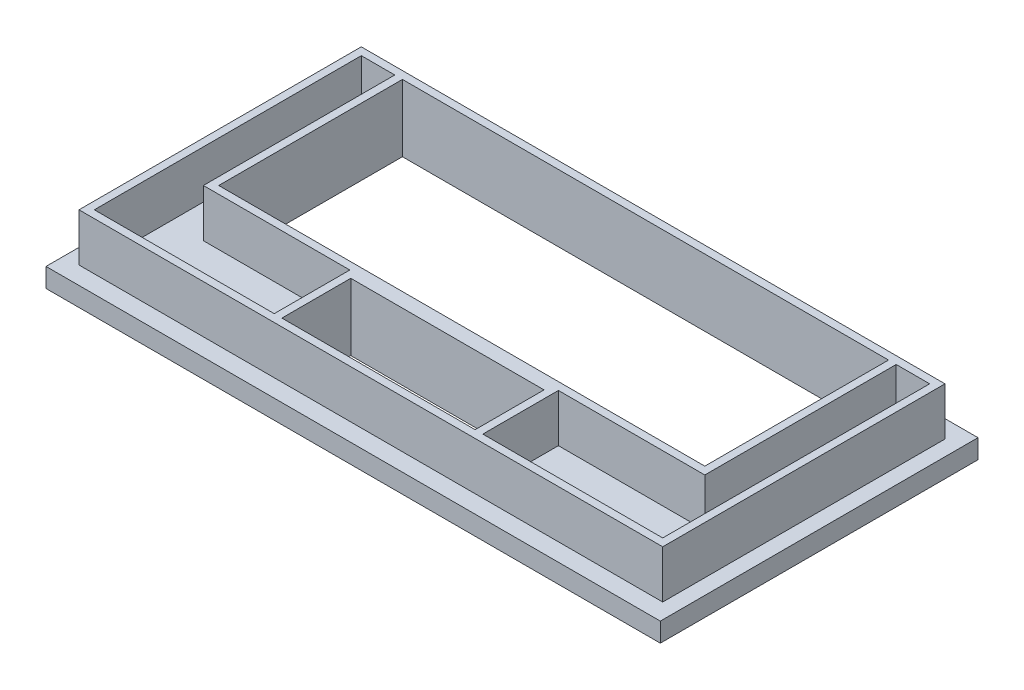
ISO-10303-21;
HEADER;
FILE_DESCRIPTION(('STEP AP214'),'2;1');
FILE_NAME('part.step','',(''),(''),'','','');
FILE_SCHEMA(('AUTOMOTIVE_DESIGN { 1 0 10303 214 1 1 1 1 }'));
ENDSEC;
DATA;
#1=APPLICATION_CONTEXT('core data for automotive mechanical design processes');
#2=APPLICATION_PROTOCOL_DEFINITION('international standard','automotive_design',2000,#1);
#3=PRODUCT_CONTEXT('',#1,'mechanical');
#4=PRODUCT('Part','Part','',(#3));
#5=PRODUCT_RELATED_PRODUCT_CATEGORY('part','',(#4));
#6=PRODUCT_DEFINITION_FORMATION('','',#4);
#7=PRODUCT_DEFINITION_CONTEXT('part definition',#1,'design');
#8=PRODUCT_DEFINITION('design','',#6,#7);
#9=PRODUCT_DEFINITION_SHAPE('','',#8);
#10=(LENGTH_UNIT() NAMED_UNIT(*) SI_UNIT(.MILLI.,.METRE.));
#11=(NAMED_UNIT(*) PLANE_ANGLE_UNIT() SI_UNIT($,.RADIAN.));
#12=(NAMED_UNIT(*) SI_UNIT($,.STERADIAN.) SOLID_ANGLE_UNIT());
#13=UNCERTAINTY_MEASURE_WITH_UNIT(LENGTH_MEASURE(1.E-05),#10,'distance_accuracy_value','');
#14=(GEOMETRIC_REPRESENTATION_CONTEXT(3) GLOBAL_UNCERTAINTY_ASSIGNED_CONTEXT((#13)) GLOBAL_UNIT_ASSIGNED_CONTEXT((#10,
#11,#12)) REPRESENTATION_CONTEXT('',''));
#15=CARTESIAN_POINT('',(0.,0.,0.));
#16=DIRECTION('',(0.,0.,1.));
#17=DIRECTION('',(1.,0.,0.));
#18=AXIS2_PLACEMENT_3D('',#15,#16,#17);
#19=CARTESIAN_POINT('',(0.,2.,0.));
#20=DIRECTION('',(0.,1.,0.));
#21=DIRECTION('',(0.,0.,1.));
#22=AXIS2_PLACEMENT_3D('',#19,#20,#21);
#23=PLANE('',#22);
#24=DIRECTION('',(1.,0.,0.));
#25=VECTOR('',#24,1.);
#26=CARTESIAN_POINT('',(-26.2,2.,6.05));
#27=LINE('',#26,#25);
#28=CARTESIAN_POINT('',(-26.2,2.,6.05));
#29=VERTEX_POINT('',#28);
#30=CARTESIAN_POINT('',(-10.9,2.,6.05));
#31=VERTEX_POINT('',#30);
#32=EDGE_CURVE('E50',#29,#31,#27,.T.);
#33=ORIENTED_EDGE('',*,*,#32,.F.);
#34=DIRECTION('',(0.,0.,1.));
#35=VECTOR('',#34,1.);
#36=CARTESIAN_POINT('',(-26.2,2.,-13.95));
#37=LINE('',#36,#35);
#38=CARTESIAN_POINT('',(-26.2,2.,-13.95));
#39=VERTEX_POINT('',#38);
#40=EDGE_CURVE('E254',#39,#29,#37,.T.);
#41=ORIENTED_EDGE('',*,*,#40,.F.);
#42=DIRECTION('',(-1.,0.,0.));
#43=VECTOR('',#42,1.);
#44=CARTESIAN_POINT('',(-29.7,2.,-13.95));
#45=LINE('',#44,#43);
#46=CARTESIAN_POINT('',(-29.7,2.,-13.95));
#47=VERTEX_POINT('',#46);
#48=EDGE_CURVE('E347',#39,#47,#45,.T.);
#49=ORIENTED_EDGE('',*,*,#48,.T.);
#50=DIRECTION('',(0.,0.,1.));
#51=VECTOR('',#50,1.);
#52=CARTESIAN_POINT('',(-29.7,2.,-13.95));
#53=LINE('',#52,#51);
#54=CARTESIAN_POINT('',(-29.7,2.,13.95));
#55=VERTEX_POINT('',#54);
#56=EDGE_CURVE('E351',#47,#55,#53,.T.);
#57=ORIENTED_EDGE('',*,*,#56,.T.);
#58=DIRECTION('',(1.,0.,0.));
#59=VECTOR('',#58,1.);
#60=CARTESIAN_POINT('',(-29.7,2.,13.95));
#61=LINE('',#60,#59);
#62=CARTESIAN_POINT('',(-10.9,2.,13.95));
#63=VERTEX_POINT('',#62);
#64=EDGE_CURVE('E334',#55,#63,#61,.T.);
#65=ORIENTED_EDGE('',*,*,#64,.T.);
#66=DIRECTION('',(0.,0.,1.));
#67=VECTOR('',#66,1.);
#68=CARTESIAN_POINT('',(-10.9,2.,6.05));
#69=LINE('',#68,#67);
#70=EDGE_CURVE('E55',#31,#63,#69,.T.);
#71=ORIENTED_EDGE('',*,*,#70,.F.);
#72=EDGE_LOOP('',(#33,#41,#49,#57,#65,#71));
#73=FACE_BOUND('',#72,.T.);
#74=ADVANCED_FACE('F35',(#73),#23,.T.);
#75=DIRECTION('',(1.,0.,0.));
#76=VECTOR('',#75,1.);
#77=CARTESIAN_POINT('',(26.2,2.,6.04999999999996));
#78=LINE('',#77,#76);
#79=CARTESIAN_POINT('',(10.9,2.,6.04999999999999));
#80=VERTEX_POINT('',#79);
#81=CARTESIAN_POINT('',(26.2,2.,6.04999999999996));
#82=VERTEX_POINT('',#81);
#83=EDGE_CURVE('E298',#80,#82,#78,.T.);
#84=ORIENTED_EDGE('',*,*,#83,.F.);
#85=DIRECTION('',(0.,0.,-1.));
#86=VECTOR('',#85,1.);
#87=CARTESIAN_POINT('',(10.9,2.,6.04999999999999));
#88=LINE('',#87,#86);
#89=CARTESIAN_POINT('',(10.9,2.,13.95));
#90=VERTEX_POINT('',#89);
#91=EDGE_CURVE('E294',#90,#80,#88,.T.);
#92=ORIENTED_EDGE('',*,*,#91,.F.);
#93=CARTESIAN_POINT('',(29.7,2.,13.95));
#94=VERTEX_POINT('',#93);
#95=EDGE_CURVE('E353',#90,#94,#61,.T.);
#96=ORIENTED_EDGE('',*,*,#95,.T.);
#97=DIRECTION('',(0.,0.,-1.));
#98=VECTOR('',#97,1.);
#99=CARTESIAN_POINT('',(29.7,2.,-13.95));
#100=LINE('',#99,#98);
#101=CARTESIAN_POINT('',(29.7,2.,-13.95));
#102=VERTEX_POINT('',#101);
#103=EDGE_CURVE('E330',#94,#102,#100,.T.);
#104=ORIENTED_EDGE('',*,*,#103,.T.);
#105=CARTESIAN_POINT('',(26.2,2.,-13.95));
#106=VERTEX_POINT('',#105);
#107=EDGE_CURVE('E348',#102,#106,#45,.T.);
#108=ORIENTED_EDGE('',*,*,#107,.T.);
#109=DIRECTION('',(0.,0.,-1.));
#110=VECTOR('',#109,1.);
#111=CARTESIAN_POINT('',(26.2,2.,-13.95));
#112=LINE('',#111,#110);
#113=EDGE_CURVE('E302',#82,#106,#112,.T.);
#114=ORIENTED_EDGE('',*,*,#113,.F.);
#115=EDGE_LOOP('',(#84,#92,#96,#104,#108,#114));
#116=FACE_BOUND('',#115,.T.);
#117=ADVANCED_FACE('F449',(#116),#23,.T.);
#118=CARTESIAN_POINT('',(-29.7,7.,-13.95));
#119=DIRECTION('',(0.,0.,1.));
#120=DIRECTION('',(1.,0.,0.));
#121=AXIS2_PLACEMENT_3D('',#118,#119,#120);
#122=PLANE('',#121);
#123=ORIENTED_EDGE('',*,*,#48,.F.);
#124=DIRECTION('',(0.,-1.,0.));
#125=VECTOR('',#124,1.);
#126=CARTESIAN_POINT('',(-26.2,66.3647201627364,-13.95));
#127=LINE('',#126,#125);
#128=CARTESIAN_POINT('',(-26.2,7.,-13.95));
#129=VERTEX_POINT('',#128);
#130=EDGE_CURVE('E282',#129,#39,#127,.T.);
#131=ORIENTED_EDGE('',*,*,#130,.F.);
#132=DIRECTION('',(-1.,0.,0.));
#133=VECTOR('',#132,1.);
#134=CARTESIAN_POINT('',(-29.7,7.,-13.95));
#135=LINE('',#134,#133);
#136=CARTESIAN_POINT('',(-29.7,7.,-13.95));
#137=VERTEX_POINT('',#136);
#138=EDGE_CURVE('E333',#129,#137,#135,.T.);
#139=ORIENTED_EDGE('',*,*,#138,.T.);
#140=DIRECTION('',(0.,-1.,0.));
#141=VECTOR('',#140,1.);
#142=CARTESIAN_POINT('',(-29.7,7.,-13.95));
#143=LINE('',#142,#141);
#144=EDGE_CURVE('E360',#137,#47,#143,.T.);
#145=ORIENTED_EDGE('',*,*,#144,.T.);
#146=EDGE_LOOP('',(#123,#131,#139,#145));
#147=FACE_BOUND('',#146,.T.);
#148=ADVANCED_FACE('F454',(#147),#122,.T.);
#149=CARTESIAN_POINT('',(29.7,7.,-13.95));
#150=VERTEX_POINT('',#149);
#151=CARTESIAN_POINT('',(26.2,7.,-13.95));
#152=VERTEX_POINT('',#151);
#153=EDGE_CURVE('E335',#150,#152,#135,.T.);
#154=ORIENTED_EDGE('',*,*,#153,.T.);
#155=DIRECTION('',(0.,-1.,0.));
#156=VECTOR('',#155,1.);
#157=CARTESIAN_POINT('',(26.2,66.3647201627364,-13.95));
#158=LINE('',#157,#156);
#159=EDGE_CURVE('E242',#152,#106,#158,.T.);
#160=ORIENTED_EDGE('',*,*,#159,.T.);
#161=ORIENTED_EDGE('',*,*,#107,.F.);
#162=DIRECTION('',(0.,-1.,0.));
#163=VECTOR('',#162,1.);
#164=CARTESIAN_POINT('',(29.7,7.,-13.95));
#165=LINE('',#164,#163);
#166=EDGE_CURVE('E363',#150,#102,#165,.T.);
#167=ORIENTED_EDGE('',*,*,#166,.F.);
#168=EDGE_LOOP('',(#154,#160,#161,#167));
#169=FACE_BOUND('',#168,.T.);
#170=ADVANCED_FACE('F519',(#169),#122,.T.);
#171=DIRECTION('',(0.,1.,0.));
#172=VECTOR('',#171,1.);
#173=CARTESIAN_POINT('',(25.4,0.,-13.95));
#174=LINE('',#173,#172);
#175=CARTESIAN_POINT('',(25.4,0.,-13.95));
#176=VERTEX_POINT('',#175);
#177=CARTESIAN_POINT('',(25.4,7.,-13.95));
#178=VERTEX_POINT('',#177);
#179=EDGE_CURVE('E309',#176,#178,#174,.T.);
#180=ORIENTED_EDGE('',*,*,#179,.T.);
#181=CARTESIAN_POINT('',(-25.4,7.,-13.95));
#182=VERTEX_POINT('',#181);
#183=EDGE_CURVE('E338',#178,#182,#135,.T.);
#184=ORIENTED_EDGE('',*,*,#183,.T.);
#185=DIRECTION('',(0.,1.,0.));
#186=VECTOR('',#185,1.);
#187=CARTESIAN_POINT('',(-25.4,0.,-13.95));
#188=LINE('',#187,#186);
#189=CARTESIAN_POINT('',(-25.4,0.,-13.95));
#190=VERTEX_POINT('',#189);
#191=EDGE_CURVE('E233',#190,#182,#188,.T.);
#192=ORIENTED_EDGE('',*,*,#191,.F.);
#193=DIRECTION('',(1.,0.,0.));
#194=VECTOR('',#193,1.);
#195=CARTESIAN_POINT('',(25.4,0.,-13.95));
#196=LINE('',#195,#194);
#197=EDGE_CURVE('E307',#190,#176,#196,.T.);
#198=ORIENTED_EDGE('',*,*,#197,.T.);
#199=EDGE_LOOP('',(#180,#184,#192,#198));
#200=FACE_BOUND('',#199,.T.);
#201=ADVANCED_FACE('F555',(#200),#122,.T.);
#202=CARTESIAN_POINT('',(-29.7,7.,13.95));
#203=DIRECTION('',(0.,0.,-1.));
#204=DIRECTION('',(-1.,0.,0.));
#205=AXIS2_PLACEMENT_3D('',#202,#203,#204);
#206=PLANE('',#205);
#207=DIRECTION('',(1.,0.,0.));
#208=VECTOR('',#207,1.);
#209=CARTESIAN_POINT('',(-29.7,7.,13.95));
#210=LINE('',#209,#208);
#211=CARTESIAN_POINT('',(-29.7,7.,13.95));
#212=VERTEX_POINT('',#211);
#213=CARTESIAN_POINT('',(-10.9,7.,13.95));
#214=VERTEX_POINT('',#213);
#215=EDGE_CURVE('E342',#212,#214,#210,.T.);
#216=ORIENTED_EDGE('',*,*,#215,.T.);
#217=DIRECTION('',(0.,-1.,0.));
#218=VECTOR('',#217,1.);
#219=CARTESIAN_POINT('',(-10.9,66.3647201627364,13.95));
#220=LINE('',#219,#218);
#221=EDGE_CURVE('E289',#214,#63,#220,.T.);
#222=ORIENTED_EDGE('',*,*,#221,.T.);
#223=ORIENTED_EDGE('',*,*,#64,.F.);
#224=DIRECTION('',(0.,-1.,0.));
#225=VECTOR('',#224,1.);
#226=CARTESIAN_POINT('',(-29.7,7.,13.95));
#227=LINE('',#226,#225);
#228=EDGE_CURVE('E357',#212,#55,#227,.T.);
#229=ORIENTED_EDGE('',*,*,#228,.F.);
#230=EDGE_LOOP('',(#216,#222,#223,#229));
#231=FACE_BOUND('',#230,.T.);
#232=ADVANCED_FACE('F470',(#231),#206,.T.);
#233=DIRECTION('',(0.,1.,0.));
#234=VECTOR('',#233,1.);
#235=CARTESIAN_POINT('',(-10.1,0.,13.95));
#236=LINE('',#235,#234);
#237=CARTESIAN_POINT('',(-10.1,0.,13.95));
#238=VERTEX_POINT('',#237);
#239=CARTESIAN_POINT('',(-10.1,7.,13.95));
#240=VERTEX_POINT('',#239);
#241=EDGE_CURVE('E322',#238,#240,#236,.T.);
#242=ORIENTED_EDGE('',*,*,#241,.T.);
#243=CARTESIAN_POINT('',(10.1,7.,13.95));
#244=VERTEX_POINT('',#243);
#245=EDGE_CURVE('E345',#240,#244,#210,.T.);
#246=ORIENTED_EDGE('',*,*,#245,.T.);
#247=DIRECTION('',(0.,1.,0.));
#248=VECTOR('',#247,1.);
#249=CARTESIAN_POINT('',(10.1,0.,13.95));
#250=LINE('',#249,#248);
#251=CARTESIAN_POINT('',(10.1,0.,13.95));
#252=VERTEX_POINT('',#251);
#253=EDGE_CURVE('E324',#252,#244,#250,.T.);
#254=ORIENTED_EDGE('',*,*,#253,.F.);
#255=DIRECTION('',(-1.,0.,0.));
#256=VECTOR('',#255,1.);
#257=CARTESIAN_POINT('',(10.1,0.,13.95));
#258=LINE('',#257,#256);
#259=EDGE_CURVE('E320',#252,#238,#258,.T.);
#260=ORIENTED_EDGE('',*,*,#259,.T.);
#261=EDGE_LOOP('',(#242,#246,#254,#260));
#262=FACE_BOUND('',#261,.T.);
#263=ADVANCED_FACE('F467',(#262),#206,.T.);
#264=ORIENTED_EDGE('',*,*,#95,.F.);
#265=DIRECTION('',(0.,-1.,0.));
#266=VECTOR('',#265,1.);
#267=CARTESIAN_POINT('',(10.9,66.3647201627364,13.95));
#268=LINE('',#267,#266);
#269=CARTESIAN_POINT('',(10.9,7.,13.95));
#270=VERTEX_POINT('',#269);
#271=EDGE_CURVE('E291',#270,#90,#268,.T.);
#272=ORIENTED_EDGE('',*,*,#271,.F.);
#273=CARTESIAN_POINT('',(29.7,7.,13.95));
#274=VERTEX_POINT('',#273);
#275=EDGE_CURVE('E341',#270,#274,#210,.T.);
#276=ORIENTED_EDGE('',*,*,#275,.T.);
#277=DIRECTION('',(0.,-1.,0.));
#278=VECTOR('',#277,1.);
#279=CARTESIAN_POINT('',(29.7,7.,13.95));
#280=LINE('',#279,#278);
#281=EDGE_CURVE('E344',#274,#94,#280,.T.);
#282=ORIENTED_EDGE('',*,*,#281,.T.);
#283=EDGE_LOOP('',(#264,#272,#276,#282));
#284=FACE_BOUND('',#283,.T.);
#285=ADVANCED_FACE('F462',(#284),#206,.T.);
#286=CARTESIAN_POINT('',(0.,0.,0.));
#287=DIRECTION('',(0.,1.,0.));
#288=DIRECTION('',(0.,0.,1.));
#289=AXIS2_PLACEMENT_3D('',#286,#287,#288);
#290=PLANE('',#289);
#291=DIRECTION('',(0.,0.,-1.));
#292=VECTOR('',#291,1.);
#293=CARTESIAN_POINT('',(-10.1,0.,6.75000000000001));
#294=LINE('',#293,#292);
#295=CARTESIAN_POINT('',(-10.1,0.,6.75000000000001));
#296=VERTEX_POINT('',#295);
#297=EDGE_CURVE('E313',#238,#296,#294,.T.);
#298=ORIENTED_EDGE('',*,*,#297,.F.);
#299=ORIENTED_EDGE('',*,*,#259,.F.);
#300=DIRECTION('',(0.,0.,1.));
#301=VECTOR('',#300,1.);
#302=CARTESIAN_POINT('',(10.1,0.,6.75000000000001));
#303=LINE('',#302,#301);
#304=CARTESIAN_POINT('',(10.1,0.,6.75000000000001));
#305=VERTEX_POINT('',#304);
#306=EDGE_CURVE('E317',#305,#252,#303,.T.);
#307=ORIENTED_EDGE('',*,*,#306,.F.);
#308=DIRECTION('',(1.,0.,0.));
#309=VECTOR('',#308,1.);
#310=CARTESIAN_POINT('',(10.1,0.,6.75000000000001));
#311=LINE('',#310,#309);
#312=EDGE_CURVE('E315',#296,#305,#311,.T.);
#313=ORIENTED_EDGE('',*,*,#312,.F.);
#314=EDGE_LOOP('',(#298,#299,#307,#313));
#315=FACE_BOUND('',#314,.T.);
#316=DIRECTION('',(0.,0.,-1.));
#317=VECTOR('',#316,1.);
#318=CARTESIAN_POINT('',(32.1,0.,-16.6));
#319=LINE('',#318,#317);
#320=CARTESIAN_POINT('',(32.1,0.,16.6));
#321=VERTEX_POINT('',#320);
#322=CARTESIAN_POINT('',(32.1,0.,-16.6));
#323=VERTEX_POINT('',#322);
#324=EDGE_CURVE('E395',#321,#323,#319,.T.);
#325=ORIENTED_EDGE('',*,*,#324,.F.);
#326=DIRECTION('',(1.,0.,0.));
#327=VECTOR('',#326,1.);
#328=CARTESIAN_POINT('',(-32.1,0.,16.6));
#329=LINE('',#328,#327);
#330=CARTESIAN_POINT('',(-32.1,0.,16.6));
#331=VERTEX_POINT('',#330);
#332=EDGE_CURVE('E400',#331,#321,#329,.T.);
#333=ORIENTED_EDGE('',*,*,#332,.F.);
#334=DIRECTION('',(0.,0.,1.));
#335=VECTOR('',#334,1.);
#336=CARTESIAN_POINT('',(-32.1,0.,-16.6));
#337=LINE('',#336,#335);
#338=CARTESIAN_POINT('',(-32.1,0.,-16.6));
#339=VERTEX_POINT('',#338);
#340=EDGE_CURVE('E411',#339,#331,#337,.T.);
#341=ORIENTED_EDGE('',*,*,#340,.F.);
#342=DIRECTION('',(-1.,0.,0.));
#343=VECTOR('',#342,1.);
#344=CARTESIAN_POINT('',(-32.1,0.,-16.6));
#345=LINE('',#344,#343);
#346=EDGE_CURVE('E409',#323,#339,#345,.T.);
#347=ORIENTED_EDGE('',*,*,#346,.F.);
#348=EDGE_LOOP('',(#325,#333,#341,#347));
#349=FACE_BOUND('',#348,.T.);
#350=DIRECTION('',(0.,0.,1.));
#351=VECTOR('',#350,1.);
#352=CARTESIAN_POINT('',(25.4,0.,-13.95));
#353=LINE('',#352,#351);
#354=CARTESIAN_POINT('',(25.4,0.,5.25));
#355=VERTEX_POINT('',#354);
#356=EDGE_CURVE('E248',#176,#355,#353,.T.);
#357=ORIENTED_EDGE('',*,*,#356,.F.);
#358=ORIENTED_EDGE('',*,*,#197,.F.);
#359=DIRECTION('',(0.,0.,-1.));
#360=VECTOR('',#359,1.);
#361=CARTESIAN_POINT('',(-25.4,0.,-13.95));
#362=LINE('',#361,#360);
#363=CARTESIAN_POINT('',(-25.4,0.,5.25));
#364=VERTEX_POINT('',#363);
#365=EDGE_CURVE('E305',#364,#190,#362,.T.);
#366=ORIENTED_EDGE('',*,*,#365,.F.);
#367=DIRECTION('',(-1.,0.,0.));
#368=VECTOR('',#367,1.);
#369=CARTESIAN_POINT('',(25.4,0.,5.25));
#370=LINE('',#369,#368);
#371=EDGE_CURVE('E228',#355,#364,#370,.T.);
#372=ORIENTED_EDGE('',*,*,#371,.F.);
#373=EDGE_LOOP('',(#357,#358,#366,#372));
#374=FACE_BOUND('',#373,.T.);
#375=ADVANCED_FACE('F429',(#315,#349,#374),#290,.F.);
#376=DIRECTION('',(0.,0.,-1.));
#377=VECTOR('',#376,1.);
#378=CARTESIAN_POINT('',(32.1,2.,-16.6));
#379=LINE('',#378,#377);
#380=CARTESIAN_POINT('',(32.1,2.,16.6));
#381=VERTEX_POINT('',#380);
#382=CARTESIAN_POINT('',(32.1,2.,-16.6));
#383=VERTEX_POINT('',#382);
#384=EDGE_CURVE('E396',#381,#383,#379,.T.);
#385=ORIENTED_EDGE('',*,*,#384,.T.);
#386=DIRECTION('',(-1.,0.,0.));
#387=VECTOR('',#386,1.);
#388=CARTESIAN_POINT('',(-32.1,2.,-16.6));
#389=LINE('',#388,#387);
#390=CARTESIAN_POINT('',(-32.1,2.,-16.6));
#391=VERTEX_POINT('',#390);
#392=EDGE_CURVE('E399',#383,#391,#389,.T.);
#393=ORIENTED_EDGE('',*,*,#392,.T.);
#394=DIRECTION('',(0.,0.,1.));
#395=VECTOR('',#394,1.);
#396=CARTESIAN_POINT('',(-32.1,2.,-16.6));
#397=LINE('',#396,#395);
#398=CARTESIAN_POINT('',(-32.1,2.,16.6));
#399=VERTEX_POINT('',#398);
#400=EDGE_CURVE('E402',#391,#399,#397,.T.);
#401=ORIENTED_EDGE('',*,*,#400,.T.);
#402=DIRECTION('',(1.,0.,0.));
#403=VECTOR('',#402,1.);
#404=CARTESIAN_POINT('',(-32.1,2.,16.6));
#405=LINE('',#404,#403);
#406=EDGE_CURVE('E404',#399,#381,#405,.T.);
#407=ORIENTED_EDGE('',*,*,#406,.T.);
#408=EDGE_LOOP('',(#385,#393,#401,#407));
#409=FACE_BOUND('',#408,.T.);
#410=DIRECTION('',(-1.,0.,0.));
#411=VECTOR('',#410,1.);
#412=CARTESIAN_POINT('',(-30.5,2.,-14.75));
#413=LINE('',#412,#411);
#414=CARTESIAN_POINT('',(30.5,2.,-14.75));
#415=VERTEX_POINT('',#414);
#416=CARTESIAN_POINT('',(-30.5,2.,-14.75));
#417=VERTEX_POINT('',#416);
#418=EDGE_CURVE('E380',#415,#417,#413,.T.);
#419=ORIENTED_EDGE('',*,*,#418,.F.);
#420=DIRECTION('',(0.,0.,-1.));
#421=VECTOR('',#420,1.);
#422=CARTESIAN_POINT('',(30.5,2.,-14.75));
#423=LINE('',#422,#421);
#424=CARTESIAN_POINT('',(30.5,2.,14.75));
#425=VERTEX_POINT('',#424);
#426=EDGE_CURVE('E366',#425,#415,#423,.T.);
#427=ORIENTED_EDGE('',*,*,#426,.F.);
#428=DIRECTION('',(1.,0.,0.));
#429=VECTOR('',#428,1.);
#430=CARTESIAN_POINT('',(-30.5,2.,14.75));
#431=LINE('',#430,#429);
#432=CARTESIAN_POINT('',(-30.5,2.,14.75));
#433=VERTEX_POINT('',#432);
#434=EDGE_CURVE('E371',#433,#425,#431,.T.);
#435=ORIENTED_EDGE('',*,*,#434,.F.);
#436=DIRECTION('',(0.,0.,1.));
#437=VECTOR('',#436,1.);
#438=CARTESIAN_POINT('',(-30.5,2.,-14.75));
#439=LINE('',#438,#437);
#440=EDGE_CURVE('E382',#417,#433,#439,.T.);
#441=ORIENTED_EDGE('',*,*,#440,.F.);
#442=EDGE_LOOP('',(#419,#427,#435,#441));
#443=FACE_BOUND('',#442,.T.);
#444=ADVANCED_FACE('F439',(#409,#443),#23,.T.);
#445=CARTESIAN_POINT('',(32.1,2.,-16.6));
#446=DIRECTION('',(-1.,0.,0.));
#447=DIRECTION('',(0.,0.,1.));
#448=AXIS2_PLACEMENT_3D('',#445,#446,#447);
#449=PLANE('',#448);
#450=ORIENTED_EDGE('',*,*,#324,.T.);
#451=DIRECTION('',(0.,-1.,0.));
#452=VECTOR('',#451,1.);
#453=CARTESIAN_POINT('',(32.1,2.,-16.6));
#454=LINE('',#453,#452);
#455=EDGE_CURVE('E11',#383,#323,#454,.T.);
#456=ORIENTED_EDGE('',*,*,#455,.F.);
#457=ORIENTED_EDGE('',*,*,#384,.F.);
#458=DIRECTION('',(0.,-1.,0.));
#459=VECTOR('',#458,1.);
#460=CARTESIAN_POINT('',(32.1,2.,16.6));
#461=LINE('',#460,#459);
#462=EDGE_CURVE('E406',#381,#321,#461,.T.);
#463=ORIENTED_EDGE('',*,*,#462,.T.);
#464=EDGE_LOOP('',(#450,#456,#457,#463));
#465=FACE_BOUND('',#464,.T.);
#466=ADVANCED_FACE('F37',(#465),#449,.F.);
#467=CARTESIAN_POINT('',(-32.1,2.,-16.6));
#468=DIRECTION('',(0.,0.,1.));
#469=DIRECTION('',(1.,0.,0.));
#470=AXIS2_PLACEMENT_3D('',#467,#468,#469);
#471=PLANE('',#470);
#472=ORIENTED_EDGE('',*,*,#346,.T.);
#473=DIRECTION('',(0.,-1.,0.));
#474=VECTOR('',#473,1.);
#475=CARTESIAN_POINT('',(-32.1,2.,-16.6));
#476=LINE('',#475,#474);
#477=EDGE_CURVE('E43',#391,#339,#476,.T.);
#478=ORIENTED_EDGE('',*,*,#477,.F.);
#479=ORIENTED_EDGE('',*,*,#392,.F.);
#480=ORIENTED_EDGE('',*,*,#455,.T.);
#481=EDGE_LOOP('',(#472,#478,#479,#480));
#482=FACE_BOUND('',#481,.T.);
#483=ADVANCED_FACE('F441',(#482),#471,.F.);
#484=CARTESIAN_POINT('',(-32.1,2.,-16.6));
#485=DIRECTION('',(1.,0.,0.));
#486=DIRECTION('',(0.,0.,-1.));
#487=AXIS2_PLACEMENT_3D('',#484,#485,#486);
#488=PLANE('',#487);
#489=ORIENTED_EDGE('',*,*,#340,.T.);
#490=DIRECTION('',(0.,-1.,0.));
#491=VECTOR('',#490,1.);
#492=CARTESIAN_POINT('',(-32.1,2.,16.6));
#493=LINE('',#492,#491);
#494=EDGE_CURVE('E416',#399,#331,#493,.T.);
#495=ORIENTED_EDGE('',*,*,#494,.F.);
#496=ORIENTED_EDGE('',*,*,#400,.F.);
#497=ORIENTED_EDGE('',*,*,#477,.T.);
#498=EDGE_LOOP('',(#489,#495,#496,#497));
#499=FACE_BOUND('',#498,.T.);
#500=ADVANCED_FACE('F423',(#499),#488,.F.);
#501=CARTESIAN_POINT('',(-32.1,2.,16.6));
#502=DIRECTION('',(0.,0.,-1.));
#503=DIRECTION('',(-1.,0.,0.));
#504=AXIS2_PLACEMENT_3D('',#501,#502,#503);
#505=PLANE('',#504);
#506=ORIENTED_EDGE('',*,*,#332,.T.);
#507=ORIENTED_EDGE('',*,*,#462,.F.);
#508=ORIENTED_EDGE('',*,*,#406,.F.);
#509=ORIENTED_EDGE('',*,*,#494,.T.);
#510=EDGE_LOOP('',(#506,#507,#508,#509));
#511=FACE_BOUND('',#510,.T.);
#512=ADVANCED_FACE('F433',(#511),#505,.F.);
#513=CARTESIAN_POINT('',(0.,7.,0.));
#514=DIRECTION('',(0.,1.,0.));
#515=DIRECTION('',(0.,0.,1.));
#516=AXIS2_PLACEMENT_3D('',#513,#514,#515);
#517=PLANE('',#516);
#518=ORIENTED_EDGE('',*,*,#183,.F.);
#519=DIRECTION('',(0.,0.,1.));
#520=VECTOR('',#519,1.);
#521=CARTESIAN_POINT('',(25.4,7.,-13.95));
#522=LINE('',#521,#520);
#523=CARTESIAN_POINT('',(25.4,7.,5.24999999999996));
#524=VERTEX_POINT('',#523);
#525=EDGE_CURVE('E247',#178,#524,#522,.T.);
#526=ORIENTED_EDGE('',*,*,#525,.T.);
#527=DIRECTION('',(-1.,0.,0.));
#528=VECTOR('',#527,1.);
#529=CARTESIAN_POINT('',(-25.4,7.,5.25));
#530=LINE('',#529,#528);
#531=CARTESIAN_POINT('',(-25.4,7.,5.25));
#532=VERTEX_POINT('',#531);
#533=EDGE_CURVE('E225',#524,#532,#530,.T.);
#534=ORIENTED_EDGE('',*,*,#533,.T.);
#535=DIRECTION('',(0.,0.,-1.));
#536=VECTOR('',#535,1.);
#537=CARTESIAN_POINT('',(-25.4,7.,-13.95));
#538=LINE('',#537,#536);
#539=EDGE_CURVE('E236',#532,#182,#538,.T.);
#540=ORIENTED_EDGE('',*,*,#539,.T.);
#541=EDGE_LOOP('',(#518,#526,#534,#540));
#542=FACE_BOUND('',#541,.T.);
#543=ORIENTED_EDGE('',*,*,#138,.F.);
#544=DIRECTION('',(0.,0.,1.));
#545=VECTOR('',#544,1.);
#546=CARTESIAN_POINT('',(-26.2,7.,-13.95));
#547=LINE('',#546,#545);
#548=CARTESIAN_POINT('',(-26.2,7.,6.05));
#549=VERTEX_POINT('',#548);
#550=EDGE_CURVE('E241',#129,#549,#547,.T.);
#551=ORIENTED_EDGE('',*,*,#550,.T.);
#552=DIRECTION('',(1.,0.,0.));
#553=VECTOR('',#552,1.);
#554=CARTESIAN_POINT('',(-26.2,7.,6.05));
#555=LINE('',#554,#553);
#556=CARTESIAN_POINT('',(-10.9,7.,6.05));
#557=VERTEX_POINT('',#556);
#558=EDGE_CURVE('E277',#549,#557,#555,.T.);
#559=ORIENTED_EDGE('',*,*,#558,.T.);
#560=DIRECTION('',(0.,0.,1.));
#561=VECTOR('',#560,1.);
#562=CARTESIAN_POINT('',(-10.9,7.,6.05));
#563=LINE('',#562,#561);
#564=EDGE_CURVE('E274',#557,#214,#563,.T.);
#565=ORIENTED_EDGE('',*,*,#564,.T.);
#566=ORIENTED_EDGE('',*,*,#215,.F.);
#567=DIRECTION('',(0.,0.,1.));
#568=VECTOR('',#567,1.);
#569=CARTESIAN_POINT('',(-29.7,7.,-13.95));
#570=LINE('',#569,#568);
#571=EDGE_CURVE('E337',#137,#212,#570,.T.);
#572=ORIENTED_EDGE('',*,*,#571,.F.);
#573=EDGE_LOOP('',(#543,#551,#559,#565,#566,#572));
#574=FACE_BOUND('',#573,.T.);
#575=ORIENTED_EDGE('',*,*,#245,.F.);
#576=DIRECTION('',(0.,0.,-1.));
#577=VECTOR('',#576,1.);
#578=CARTESIAN_POINT('',(-10.1,7.,13.95));
#579=LINE('',#578,#577);
#580=CARTESIAN_POINT('',(-10.1,7.,6.75000000000001));
#581=VERTEX_POINT('',#580);
#582=EDGE_CURVE('E271',#240,#581,#579,.T.);
#583=ORIENTED_EDGE('',*,*,#582,.T.);
#584=DIRECTION('',(1.,0.,0.));
#585=VECTOR('',#584,1.);
#586=CARTESIAN_POINT('',(-10.1,7.,6.75000000000001));
#587=LINE('',#586,#585);
#588=CARTESIAN_POINT('',(10.1,7.,6.74999999999999));
#589=VERTEX_POINT('',#588);
#590=EDGE_CURVE('E268',#581,#589,#587,.T.);
#591=ORIENTED_EDGE('',*,*,#590,.T.);
#592=DIRECTION('',(0.,0.,1.));
#593=VECTOR('',#592,1.);
#594=CARTESIAN_POINT('',(10.1,7.,13.95));
#595=LINE('',#594,#593);
#596=EDGE_CURVE('E265',#589,#244,#595,.T.);
#597=ORIENTED_EDGE('',*,*,#596,.T.);
#598=EDGE_LOOP('',(#575,#583,#591,#597));
#599=FACE_BOUND('',#598,.T.);
#600=DIRECTION('',(0.,0.,-1.));
#601=VECTOR('',#600,1.);
#602=CARTESIAN_POINT('',(30.5,7.,-14.75));
#603=LINE('',#602,#601);
#604=CARTESIAN_POINT('',(30.5,7.,14.75));
#605=VERTEX_POINT('',#604);
#606=CARTESIAN_POINT('',(30.5,7.,-14.75));
#607=VERTEX_POINT('',#606);
#608=EDGE_CURVE('E367',#605,#607,#603,.T.);
#609=ORIENTED_EDGE('',*,*,#608,.T.);
#610=DIRECTION('',(-1.,0.,0.));
#611=VECTOR('',#610,1.);
#612=CARTESIAN_POINT('',(-30.5,7.,-14.75));
#613=LINE('',#612,#611);
#614=CARTESIAN_POINT('',(-30.5,7.,-14.75));
#615=VERTEX_POINT('',#614);
#616=EDGE_CURVE('E370',#607,#615,#613,.T.);
#617=ORIENTED_EDGE('',*,*,#616,.T.);
#618=DIRECTION('',(0.,0.,1.));
#619=VECTOR('',#618,1.);
#620=CARTESIAN_POINT('',(-30.5,7.,-14.75));
#621=LINE('',#620,#619);
#622=CARTESIAN_POINT('',(-30.5,7.,14.75));
#623=VERTEX_POINT('',#622);
#624=EDGE_CURVE('E373',#615,#623,#621,.T.);
#625=ORIENTED_EDGE('',*,*,#624,.T.);
#626=DIRECTION('',(1.,0.,0.));
#627=VECTOR('',#626,1.);
#628=CARTESIAN_POINT('',(-30.5,7.,14.75));
#629=LINE('',#628,#627);
#630=EDGE_CURVE('E375',#623,#605,#629,.T.);
#631=ORIENTED_EDGE('',*,*,#630,.T.);
#632=EDGE_LOOP('',(#609,#617,#625,#631));
#633=FACE_BOUND('',#632,.T.);
#634=ORIENTED_EDGE('',*,*,#153,.F.);
#635=DIRECTION('',(0.,0.,-1.));
#636=VECTOR('',#635,1.);
#637=CARTESIAN_POINT('',(29.7,7.,-13.95));
#638=LINE('',#637,#636);
#639=EDGE_CURVE('E331',#274,#150,#638,.T.);
#640=ORIENTED_EDGE('',*,*,#639,.F.);
#641=ORIENTED_EDGE('',*,*,#275,.F.);
#642=DIRECTION('',(0.,0.,-1.));
#643=VECTOR('',#642,1.);
#644=CARTESIAN_POINT('',(10.9,7.,6.04999999999999));
#645=LINE('',#644,#643);
#646=CARTESIAN_POINT('',(10.9,7.,6.04999999999999));
#647=VERTEX_POINT('',#646);
#648=EDGE_CURVE('E262',#270,#647,#645,.T.);
#649=ORIENTED_EDGE('',*,*,#648,.T.);
#650=DIRECTION('',(1.,0.,0.));
#651=VECTOR('',#650,1.);
#652=CARTESIAN_POINT('',(26.2,7.,6.04999999999996));
#653=LINE('',#652,#651);
#654=CARTESIAN_POINT('',(26.2,7.,6.04999999999996));
#655=VERTEX_POINT('',#654);
#656=EDGE_CURVE('E259',#647,#655,#653,.T.);
#657=ORIENTED_EDGE('',*,*,#656,.T.);
#658=DIRECTION('',(0.,0.,-1.));
#659=VECTOR('',#658,1.);
#660=CARTESIAN_POINT('',(26.2,7.,-13.95));
#661=LINE('',#660,#659);
#662=EDGE_CURVE('E251',#655,#152,#661,.T.);
#663=ORIENTED_EDGE('',*,*,#662,.T.);
#664=EDGE_LOOP('',(#634,#640,#641,#649,#657,#663));
#665=FACE_BOUND('',#664,.T.);
#666=ADVANCED_FACE('F244',(#542,#574,#599,#633,#665),#517,.T.);
#667=CARTESIAN_POINT('',(30.5,7.,-14.75));
#668=DIRECTION('',(-1.,0.,0.));
#669=DIRECTION('',(0.,0.,1.));
#670=AXIS2_PLACEMENT_3D('',#667,#668,#669);
#671=PLANE('',#670);
#672=ORIENTED_EDGE('',*,*,#426,.T.);
#673=DIRECTION('',(0.,-1.,0.));
#674=VECTOR('',#673,1.);
#675=CARTESIAN_POINT('',(30.5,7.,-14.75));
#676=LINE('',#675,#674);
#677=EDGE_CURVE('E393',#607,#415,#676,.T.);
#678=ORIENTED_EDGE('',*,*,#677,.F.);
#679=ORIENTED_EDGE('',*,*,#608,.F.);
#680=DIRECTION('',(0.,-1.,0.));
#681=VECTOR('',#680,1.);
#682=CARTESIAN_POINT('',(30.5,7.,14.75));
#683=LINE('',#682,#681);
#684=EDGE_CURVE('E377',#605,#425,#683,.T.);
#685=ORIENTED_EDGE('',*,*,#684,.T.);
#686=EDGE_LOOP('',(#672,#678,#679,#685));
#687=FACE_BOUND('',#686,.T.);
#688=ADVANCED_FACE('F477',(#687),#671,.F.);
#689=CARTESIAN_POINT('',(-30.5,7.,-14.75));
#690=DIRECTION('',(0.,0.,1.));
#691=DIRECTION('',(1.,0.,0.));
#692=AXIS2_PLACEMENT_3D('',#689,#690,#691);
#693=PLANE('',#692);
#694=ORIENTED_EDGE('',*,*,#418,.T.);
#695=DIRECTION('',(0.,-1.,0.));
#696=VECTOR('',#695,1.);
#697=CARTESIAN_POINT('',(-30.5,7.,-14.75));
#698=LINE('',#697,#696);
#699=EDGE_CURVE('E390',#615,#417,#698,.T.);
#700=ORIENTED_EDGE('',*,*,#699,.F.);
#701=ORIENTED_EDGE('',*,*,#616,.F.);
#702=ORIENTED_EDGE('',*,*,#677,.T.);
#703=EDGE_LOOP('',(#694,#700,#701,#702));
#704=FACE_BOUND('',#703,.T.);
#705=ADVANCED_FACE('F482',(#704),#693,.F.);
#706=CARTESIAN_POINT('',(-30.5,7.,-14.75));
#707=DIRECTION('',(1.,0.,0.));
#708=DIRECTION('',(0.,0.,-1.));
#709=AXIS2_PLACEMENT_3D('',#706,#707,#708);
#710=PLANE('',#709);
#711=ORIENTED_EDGE('',*,*,#440,.T.);
#712=DIRECTION('',(0.,-1.,0.));
#713=VECTOR('',#712,1.);
#714=CARTESIAN_POINT('',(-30.5,7.,14.75));
#715=LINE('',#714,#713);
#716=EDGE_CURVE('E388',#623,#433,#715,.T.);
#717=ORIENTED_EDGE('',*,*,#716,.F.);
#718=ORIENTED_EDGE('',*,*,#624,.F.);
#719=ORIENTED_EDGE('',*,*,#699,.T.);
#720=EDGE_LOOP('',(#711,#717,#718,#719));
#721=FACE_BOUND('',#720,.T.);
#722=ADVANCED_FACE('F491',(#721),#710,.F.);
#723=CARTESIAN_POINT('',(-30.5,7.,14.75));
#724=DIRECTION('',(0.,0.,-1.));
#725=DIRECTION('',(-1.,0.,0.));
#726=AXIS2_PLACEMENT_3D('',#723,#724,#725);
#727=PLANE('',#726);
#728=ORIENTED_EDGE('',*,*,#434,.T.);
#729=ORIENTED_EDGE('',*,*,#684,.F.);
#730=ORIENTED_EDGE('',*,*,#630,.F.);
#731=ORIENTED_EDGE('',*,*,#716,.T.);
#732=EDGE_LOOP('',(#728,#729,#730,#731));
#733=FACE_BOUND('',#732,.T.);
#734=ADVANCED_FACE('F488',(#733),#727,.F.);
#735=CARTESIAN_POINT('',(29.7,7.,-13.95));
#736=DIRECTION('',(-1.,0.,0.));
#737=DIRECTION('',(0.,0.,1.));
#738=AXIS2_PLACEMENT_3D('',#735,#736,#737);
#739=PLANE('',#738);
#740=ORIENTED_EDGE('',*,*,#103,.F.);
#741=ORIENTED_EDGE('',*,*,#281,.F.);
#742=ORIENTED_EDGE('',*,*,#639,.T.);
#743=ORIENTED_EDGE('',*,*,#166,.T.);
#744=EDGE_LOOP('',(#740,#741,#742,#743));
#745=FACE_BOUND('',#744,.T.);
#746=ADVANCED_FACE('F486',(#745),#739,.T.);
#747=CARTESIAN_POINT('',(-29.7,7.,-13.95));
#748=DIRECTION('',(1.,0.,0.));
#749=DIRECTION('',(0.,0.,-1.));
#750=AXIS2_PLACEMENT_3D('',#747,#748,#749);
#751=PLANE('',#750);
#752=ORIENTED_EDGE('',*,*,#56,.F.);
#753=ORIENTED_EDGE('',*,*,#144,.F.);
#754=ORIENTED_EDGE('',*,*,#571,.T.);
#755=ORIENTED_EDGE('',*,*,#228,.T.);
#756=EDGE_LOOP('',(#752,#753,#754,#755));
#757=FACE_BOUND('',#756,.T.);
#758=ADVANCED_FACE('F546',(#757),#751,.T.);
#759=CARTESIAN_POINT('',(-10.1,0.,6.75000000000001));
#760=DIRECTION('',(1.,0.,0.));
#761=DIRECTION('',(0.,0.,1.));
#762=AXIS2_PLACEMENT_3D('',#759,#760,#761);
#763=PLANE('',#762);
#764=ORIENTED_EDGE('',*,*,#241,.F.);
#765=ORIENTED_EDGE('',*,*,#297,.T.);
#766=DIRECTION('',(0.,1.,0.));
#767=VECTOR('',#766,1.);
#768=CARTESIAN_POINT('',(-10.1,0.,6.75000000000001));
#769=LINE('',#768,#767);
#770=EDGE_CURVE('E328',#296,#581,#769,.T.);
#771=ORIENTED_EDGE('',*,*,#770,.T.);
#772=ORIENTED_EDGE('',*,*,#582,.F.);
#773=EDGE_LOOP('',(#764,#765,#771,#772));
#774=FACE_BOUND('',#773,.T.);
#775=ADVANCED_FACE('F576',(#774),#763,.T.);
#776=CARTESIAN_POINT('',(10.1,0.,6.75000000000001));
#777=DIRECTION('',(0.,0.,1.));
#778=DIRECTION('',(-1.,0.,0.));
#779=AXIS2_PLACEMENT_3D('',#776,#777,#778);
#780=PLANE('',#779);
#781=ORIENTED_EDGE('',*,*,#770,.F.);
#782=ORIENTED_EDGE('',*,*,#312,.T.);
#783=DIRECTION('',(0.,1.,0.));
#784=VECTOR('',#783,1.);
#785=CARTESIAN_POINT('',(10.1,0.,6.75000000000001));
#786=LINE('',#785,#784);
#787=EDGE_CURVE('E326',#305,#589,#786,.T.);
#788=ORIENTED_EDGE('',*,*,#787,.T.);
#789=ORIENTED_EDGE('',*,*,#590,.F.);
#790=EDGE_LOOP('',(#781,#782,#788,#789));
#791=FACE_BOUND('',#790,.T.);
#792=ADVANCED_FACE('F569',(#791),#780,.T.);
#793=CARTESIAN_POINT('',(10.1,0.,6.75000000000001));
#794=DIRECTION('',(-1.,0.,0.));
#795=DIRECTION('',(0.,0.,-1.));
#796=AXIS2_PLACEMENT_3D('',#793,#794,#795);
#797=PLANE('',#796);
#798=ORIENTED_EDGE('',*,*,#787,.F.);
#799=ORIENTED_EDGE('',*,*,#306,.T.);
#800=ORIENTED_EDGE('',*,*,#253,.T.);
#801=ORIENTED_EDGE('',*,*,#596,.F.);
#802=EDGE_LOOP('',(#798,#799,#800,#801));
#803=FACE_BOUND('',#802,.T.);
#804=ADVANCED_FACE('F562',(#803),#797,.T.);
#805=CARTESIAN_POINT('',(25.4,0.,-13.95));
#806=DIRECTION('',(-1.,0.,0.));
#807=DIRECTION('',(0.,0.,-1.));
#808=AXIS2_PLACEMENT_3D('',#805,#806,#807);
#809=PLANE('',#808);
#810=ORIENTED_EDGE('',*,*,#179,.F.);
#811=ORIENTED_EDGE('',*,*,#356,.T.);
#812=DIRECTION('',(0.,1.,0.));
#813=VECTOR('',#812,1.);
#814=CARTESIAN_POINT('',(25.4,0.,5.25));
#815=LINE('',#814,#813);
#816=EDGE_CURVE('E232',#355,#524,#815,.T.);
#817=ORIENTED_EDGE('',*,*,#816,.T.);
#818=ORIENTED_EDGE('',*,*,#525,.F.);
#819=EDGE_LOOP('',(#810,#811,#817,#818));
#820=FACE_BOUND('',#819,.T.);
#821=ADVANCED_FACE('F558',(#820),#809,.T.);
#822=CARTESIAN_POINT('',(25.4,0.,5.25));
#823=DIRECTION('',(0.,0.,-1.));
#824=DIRECTION('',(1.,0.,0.));
#825=AXIS2_PLACEMENT_3D('',#822,#823,#824);
#826=PLANE('',#825);
#827=ORIENTED_EDGE('',*,*,#816,.F.);
#828=ORIENTED_EDGE('',*,*,#371,.T.);
#829=DIRECTION('',(0.,1.,0.));
#830=VECTOR('',#829,1.);
#831=CARTESIAN_POINT('',(-25.4,0.,5.25));
#832=LINE('',#831,#830);
#833=EDGE_CURVE('E220',#364,#532,#832,.T.);
#834=ORIENTED_EDGE('',*,*,#833,.T.);
#835=ORIENTED_EDGE('',*,*,#533,.F.);
#836=EDGE_LOOP('',(#827,#828,#834,#835));
#837=FACE_BOUND('',#836,.T.);
#838=ADVANCED_FACE('F223',(#837),#826,.T.);
#839=CARTESIAN_POINT('',(-25.4,0.,-13.95));
#840=DIRECTION('',(1.,0.,0.));
#841=DIRECTION('',(0.,0.,1.));
#842=AXIS2_PLACEMENT_3D('',#839,#840,#841);
#843=PLANE('',#842);
#844=ORIENTED_EDGE('',*,*,#833,.F.);
#845=ORIENTED_EDGE('',*,*,#365,.T.);
#846=ORIENTED_EDGE('',*,*,#191,.T.);
#847=ORIENTED_EDGE('',*,*,#539,.F.);
#848=EDGE_LOOP('',(#844,#845,#846,#847));
#849=FACE_BOUND('',#848,.T.);
#850=ADVANCED_FACE('F237',(#849),#843,.T.);
#851=CARTESIAN_POINT('',(-26.2,66.3647201627364,-13.95));
#852=DIRECTION('',(1.,0.,0.));
#853=DIRECTION('',(0.,0.,-1.));
#854=AXIS2_PLACEMENT_3D('',#851,#852,#853);
#855=PLANE('',#854);
#856=ORIENTED_EDGE('',*,*,#550,.F.);
#857=ORIENTED_EDGE('',*,*,#130,.T.);
#858=ORIENTED_EDGE('',*,*,#40,.T.);
#859=DIRECTION('',(0.,-1.,0.));
#860=VECTOR('',#859,1.);
#861=CARTESIAN_POINT('',(-26.2,66.3647201627364,6.05));
#862=LINE('',#861,#860);
#863=EDGE_CURVE('E285',#549,#29,#862,.T.);
#864=ORIENTED_EDGE('',*,*,#863,.F.);
#865=EDGE_LOOP('',(#856,#857,#858,#864));
#866=FACE_BOUND('',#865,.T.);
#867=ADVANCED_FACE('F538',(#866),#855,.F.);
#868=CARTESIAN_POINT('',(-26.2,66.3647201627364,6.05));
#869=DIRECTION('',(0.,0.,-1.));
#870=DIRECTION('',(-1.,0.,0.));
#871=AXIS2_PLACEMENT_3D('',#868,#869,#870);
#872=PLANE('',#871);
#873=ORIENTED_EDGE('',*,*,#558,.F.);
#874=ORIENTED_EDGE('',*,*,#863,.T.);
#875=ORIENTED_EDGE('',*,*,#32,.T.);
#876=DIRECTION('',(0.,-1.,0.));
#877=VECTOR('',#876,1.);
#878=CARTESIAN_POINT('',(-10.9,66.3647201627364,6.05));
#879=LINE('',#878,#877);
#880=EDGE_CURVE('E287',#557,#31,#879,.T.);
#881=ORIENTED_EDGE('',*,*,#880,.F.);
#882=EDGE_LOOP('',(#873,#874,#875,#881));
#883=FACE_BOUND('',#882,.T.);
#884=ADVANCED_FACE('F533',(#883),#872,.F.);
#885=CARTESIAN_POINT('',(-10.9,66.3647201627364,6.05));
#886=DIRECTION('',(1.,0.,0.));
#887=DIRECTION('',(0.,0.,-1.));
#888=AXIS2_PLACEMENT_3D('',#885,#886,#887);
#889=PLANE('',#888);
#890=ORIENTED_EDGE('',*,*,#564,.F.);
#891=ORIENTED_EDGE('',*,*,#880,.T.);
#892=ORIENTED_EDGE('',*,*,#70,.T.);
#893=ORIENTED_EDGE('',*,*,#221,.F.);
#894=EDGE_LOOP('',(#890,#891,#892,#893));
#895=FACE_BOUND('',#894,.T.);
#896=ADVANCED_FACE('F551',(#895),#889,.F.);
#897=CARTESIAN_POINT('',(10.9,66.3647201627364,6.04999999999999));
#898=DIRECTION('',(-1.,0.,0.));
#899=DIRECTION('',(0.,0.,1.));
#900=AXIS2_PLACEMENT_3D('',#897,#898,#899);
#901=PLANE('',#900);
#902=ORIENTED_EDGE('',*,*,#648,.F.);
#903=ORIENTED_EDGE('',*,*,#271,.T.);
#904=ORIENTED_EDGE('',*,*,#91,.T.);
#905=DIRECTION('',(0.,-1.,0.));
#906=VECTOR('',#905,1.);
#907=CARTESIAN_POINT('',(10.9,66.3647201627364,6.04999999999999));
#908=LINE('',#907,#906);
#909=EDGE_CURVE('E295',#647,#80,#908,.T.);
#910=ORIENTED_EDGE('',*,*,#909,.F.);
#911=EDGE_LOOP('',(#902,#903,#904,#910));
#912=FACE_BOUND('',#911,.T.);
#913=ADVANCED_FACE('F680',(#912),#901,.F.);
#914=CARTESIAN_POINT('',(26.2,66.3647201627364,6.04999999999996));
#915=DIRECTION('',(0.,0.,-1.));
#916=DIRECTION('',(-1.,0.,0.));
#917=AXIS2_PLACEMENT_3D('',#914,#915,#916);
#918=PLANE('',#917);
#919=ORIENTED_EDGE('',*,*,#656,.F.);
#920=ORIENTED_EDGE('',*,*,#909,.T.);
#921=ORIENTED_EDGE('',*,*,#83,.T.);
#922=DIRECTION('',(0.,-1.,0.));
#923=VECTOR('',#922,1.);
#924=CARTESIAN_POINT('',(26.2,66.3647201627364,6.04999999999996));
#925=LINE('',#924,#923);
#926=EDGE_CURVE('E299',#655,#82,#925,.T.);
#927=ORIENTED_EDGE('',*,*,#926,.F.);
#928=EDGE_LOOP('',(#919,#920,#921,#927));
#929=FACE_BOUND('',#928,.T.);
#930=ADVANCED_FACE('F689',(#929),#918,.F.);
#931=CARTESIAN_POINT('',(26.2,66.3647201627364,-13.95));
#932=DIRECTION('',(-1.,0.,0.));
#933=DIRECTION('',(0.,0.,1.));
#934=AXIS2_PLACEMENT_3D('',#931,#932,#933);
#935=PLANE('',#934);
#936=ORIENTED_EDGE('',*,*,#662,.F.);
#937=ORIENTED_EDGE('',*,*,#926,.T.);
#938=ORIENTED_EDGE('',*,*,#113,.T.);
#939=ORIENTED_EDGE('',*,*,#159,.F.);
#940=EDGE_LOOP('',(#936,#937,#938,#939));
#941=FACE_BOUND('',#940,.T.);
#942=ADVANCED_FACE('F523',(#941),#935,.F.);
#943=CLOSED_SHELL('',(#74,#117,#148,#170,#201,#232,#263,#285,#375,#444,#466,#483,#500,#512,#666,
#688,#705,#722,#734,#746,#758,#775,#792,#804,#821,#838,#850,#867,#884,#896,#913,#930,#942));
#944=MANIFOLD_SOLID_BREP('B2',#943);
#945=ADVANCED_BREP_SHAPE_REPRESENTATION('',(#18,#944),#14);
#946=SHAPE_DEFINITION_REPRESENTATION(#9,#945);
ENDSEC;
END-ISO-10303-21;
